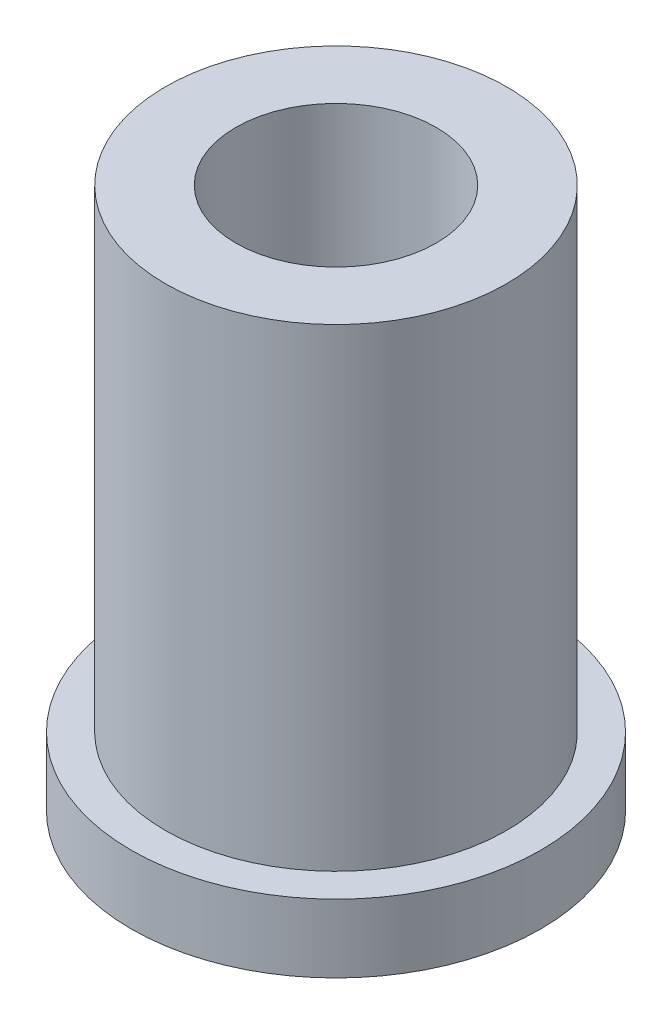
ISO-10303-21;
HEADER;
FILE_DESCRIPTION(('STEP AP214'),'2;1');
FILE_NAME('part.step','',(''),(''),'','','');
FILE_SCHEMA(('AUTOMOTIVE_DESIGN { 1 0 10303 214 1 1 1 1 }'));
ENDSEC;
DATA;
#1=APPLICATION_CONTEXT('core data for automotive mechanical design processes');
#2=APPLICATION_PROTOCOL_DEFINITION('international standard','automotive_design',2000,#1);
#3=PRODUCT_CONTEXT('',#1,'mechanical');
#4=PRODUCT('Part','Part','',(#3));
#5=PRODUCT_RELATED_PRODUCT_CATEGORY('part','',(#4));
#6=PRODUCT_DEFINITION_FORMATION('','',#4);
#7=PRODUCT_DEFINITION_CONTEXT('part definition',#1,'design');
#8=PRODUCT_DEFINITION('design','',#6,#7);
#9=PRODUCT_DEFINITION_SHAPE('','',#8);
#10=(LENGTH_UNIT() NAMED_UNIT(*) SI_UNIT(.MILLI.,.METRE.));
#11=(NAMED_UNIT(*) PLANE_ANGLE_UNIT() SI_UNIT($,.RADIAN.));
#12=(NAMED_UNIT(*) SI_UNIT($,.STERADIAN.) SOLID_ANGLE_UNIT());
#13=UNCERTAINTY_MEASURE_WITH_UNIT(LENGTH_MEASURE(1.E-05),#10,'distance_accuracy_value','');
#14=(GEOMETRIC_REPRESENTATION_CONTEXT(3) GLOBAL_UNCERTAINTY_ASSIGNED_CONTEXT((#13)) GLOBAL_UNIT_ASSIGNED_CONTEXT((#10,
#11,#12)) REPRESENTATION_CONTEXT('',''));
#15=CARTESIAN_POINT('',(0.,0.,0.));
#16=DIRECTION('',(0.,0.,1.));
#17=DIRECTION('',(1.,0.,0.));
#18=AXIS2_PLACEMENT_3D('',#15,#16,#17);
#19=CARTESIAN_POINT('',(0.,12.7,0.));
#20=DIRECTION('',(0.,-1.,0.));
#21=DIRECTION('',(0.,0.,-1.));
#22=AXIS2_PLACEMENT_3D('',#19,#20,#21);
#23=CYLINDRICAL_SURFACE('',#22,2.35);
#24=CARTESIAN_POINT('',(0.,12.7,0.));
#25=DIRECTION('',(0.,1.,0.));
#26=DIRECTION('',(0.,0.,1.));
#27=AXIS2_PLACEMENT_3D('',#24,#25,#26);
#28=CIRCLE('',#27,2.35);
#29=CARTESIAN_POINT('',(0.,12.7,2.35));
#30=VERTEX_POINT('',#29);
#31=EDGE_CURVE('E47',#30,#30,#28,.T.);
#32=ORIENTED_EDGE('',*,*,#31,.T.);
#33=EDGE_LOOP('',(#32));
#34=FACE_BOUND('',#33,.T.);
#35=CARTESIAN_POINT('',(0.,0.,0.));
#36=DIRECTION('',(0.,1.,0.));
#37=DIRECTION('',(0.,0.,1.));
#38=AXIS2_PLACEMENT_3D('',#35,#36,#37);
#39=CIRCLE('',#38,2.35);
#40=CARTESIAN_POINT('',(0.,0.,2.35));
#41=VERTEX_POINT('',#40);
#42=EDGE_CURVE('E43',#41,#41,#39,.T.);
#43=ORIENTED_EDGE('',*,*,#42,.F.);
#44=EDGE_LOOP('',(#43));
#45=FACE_BOUND('',#44,.T.);
#46=ADVANCED_FACE('F40',(#34,#45),#23,.F.);
#47=CARTESIAN_POINT('',(0.,12.7,0.));
#48=DIRECTION('',(0.,-1.,0.));
#49=DIRECTION('',(0.,0.,-1.));
#50=AXIS2_PLACEMENT_3D('',#47,#48,#49);
#51=CYLINDRICAL_SURFACE('',#50,4.);
#52=CARTESIAN_POINT('',(0.,1.6,0.));
#53=DIRECTION('',(0.,1.,0.));
#54=DIRECTION('',(0.,0.,1.));
#55=AXIS2_PLACEMENT_3D('',#52,#53,#54);
#56=CIRCLE('',#55,4.);
#57=CARTESIAN_POINT('',(0.,1.6,4.));
#58=VERTEX_POINT('',#57);
#59=EDGE_CURVE('E56',#58,#58,#56,.T.);
#60=ORIENTED_EDGE('',*,*,#59,.T.);
#61=EDGE_LOOP('',(#60));
#62=FACE_BOUND('',#61,.T.);
#63=CARTESIAN_POINT('',(0.,12.7,0.));
#64=DIRECTION('',(0.,1.,0.));
#65=DIRECTION('',(0.,0.,1.));
#66=AXIS2_PLACEMENT_3D('',#63,#64,#65);
#67=CIRCLE('',#66,4.);
#68=CARTESIAN_POINT('',(0.,12.7,4.));
#69=VERTEX_POINT('',#68);
#70=EDGE_CURVE('E10',#69,#69,#67,.T.);
#71=ORIENTED_EDGE('',*,*,#70,.F.);
#72=EDGE_LOOP('',(#71));
#73=FACE_BOUND('',#72,.T.);
#74=ADVANCED_FACE('F63',(#62,#73),#51,.T.);
#75=CARTESIAN_POINT('',(0.,12.7,0.));
#76=DIRECTION('',(0.,1.,0.));
#77=DIRECTION('',(0.,0.,1.));
#78=AXIS2_PLACEMENT_3D('',#75,#76,#77);
#79=PLANE('',#78);
#80=ORIENTED_EDGE('',*,*,#31,.F.);
#81=EDGE_LOOP('',(#80));
#82=FACE_BOUND('',#81,.T.);
#83=ORIENTED_EDGE('',*,*,#70,.T.);
#84=EDGE_LOOP('',(#83));
#85=FACE_BOUND('',#84,.T.);
#86=ADVANCED_FACE('F80',(#82,#85),#79,.T.);
#87=CARTESIAN_POINT('',(0.,0.,0.));
#88=DIRECTION('',(0.,1.,0.));
#89=DIRECTION('',(0.,0.,1.));
#90=AXIS2_PLACEMENT_3D('',#87,#88,#89);
#91=PLANE('',#90);
#92=ORIENTED_EDGE('',*,*,#42,.T.);
#93=EDGE_LOOP('',(#92));
#94=FACE_BOUND('',#93,.T.);
#95=CARTESIAN_POINT('',(0.,0.,0.));
#96=DIRECTION('',(0.,1.,0.));
#97=DIRECTION('',(0.,0.,1.));
#98=AXIS2_PLACEMENT_3D('',#95,#96,#97);
#99=CIRCLE('',#98,4.8);
#100=CARTESIAN_POINT('',(0.,0.,4.8));
#101=VERTEX_POINT('',#100);
#102=EDGE_CURVE('E53',#101,#101,#99,.T.);
#103=ORIENTED_EDGE('',*,*,#102,.F.);
#104=EDGE_LOOP('',(#103));
#105=FACE_BOUND('',#104,.T.);
#106=ADVANCED_FACE('F75',(#94,#105),#91,.F.);
#107=CARTESIAN_POINT('',(0.,1.6,0.));
#108=DIRECTION('',(0.,-1.,0.));
#109=DIRECTION('',(0.,0.,-1.));
#110=AXIS2_PLACEMENT_3D('',#107,#108,#109);
#111=CYLINDRICAL_SURFACE('',#110,4.8);
#112=CARTESIAN_POINT('',(0.,1.6,0.));
#113=DIRECTION('',(0.,1.,0.));
#114=DIRECTION('',(0.,0.,1.));
#115=AXIS2_PLACEMENT_3D('',#112,#113,#114);
#116=CIRCLE('',#115,4.8);
#117=CARTESIAN_POINT('',(0.,1.6,4.8));
#118=VERTEX_POINT('',#117);
#119=EDGE_CURVE('E57',#118,#118,#116,.T.);
#120=ORIENTED_EDGE('',*,*,#119,.F.);
#121=EDGE_LOOP('',(#120));
#122=FACE_BOUND('',#121,.T.);
#123=ORIENTED_EDGE('',*,*,#102,.T.);
#124=EDGE_LOOP('',(#123));
#125=FACE_BOUND('',#124,.T.);
#126=ADVANCED_FACE('F69',(#122,#125),#111,.T.);
#127=CARTESIAN_POINT('',(0.,1.6,0.));
#128=DIRECTION('',(0.,1.,0.));
#129=DIRECTION('',(0.,0.,1.));
#130=AXIS2_PLACEMENT_3D('',#127,#128,#129);
#131=PLANE('',#130);
#132=ORIENTED_EDGE('',*,*,#59,.F.);
#133=EDGE_LOOP('',(#132));
#134=FACE_BOUND('',#133,.T.);
#135=ORIENTED_EDGE('',*,*,#119,.T.);
#136=EDGE_LOOP('',(#135));
#137=FACE_BOUND('',#136,.T.);
#138=ADVANCED_FACE('F66',(#134,#137),#131,.T.);
#139=CLOSED_SHELL('',(#46,#74,#86,#106,#126,#138));
#140=MANIFOLD_SOLID_BREP('B2',#139);
#141=ADVANCED_BREP_SHAPE_REPRESENTATION('',(#18,#140),#14);
#142=SHAPE_DEFINITION_REPRESENTATION(#9,#141);
ENDSEC;
END-ISO-10303-21;
